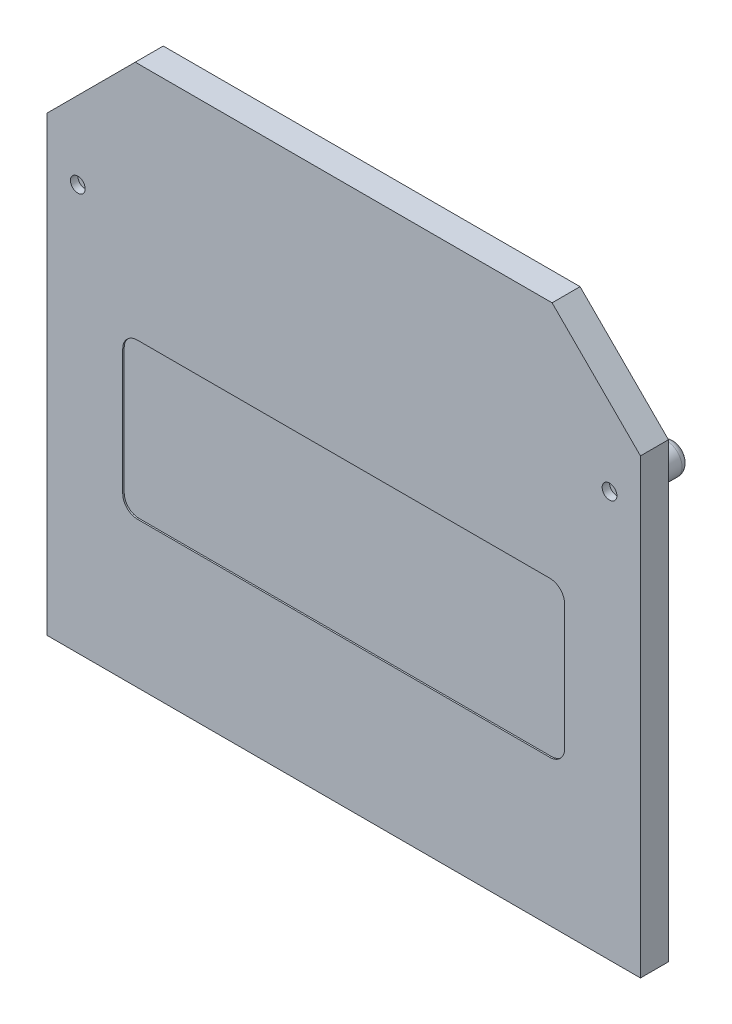
ISO-10303-21;
HEADER;
FILE_DESCRIPTION(('STEP AP214'),'2;1');
FILE_NAME('part.step','',(''),(''),'','','');
FILE_SCHEMA(('AUTOMOTIVE_DESIGN { 1 0 10303 214 1 1 1 1 }'));
ENDSEC;
DATA;
#1=APPLICATION_CONTEXT('core data for automotive mechanical design processes');
#2=APPLICATION_PROTOCOL_DEFINITION('international standard','automotive_design',2000,#1);
#3=PRODUCT_CONTEXT('',#1,'mechanical');
#4=PRODUCT('Part','Part','',(#3));
#5=PRODUCT_RELATED_PRODUCT_CATEGORY('part','',(#4));
#6=PRODUCT_DEFINITION_FORMATION('','',#4);
#7=PRODUCT_DEFINITION_CONTEXT('part definition',#1,'design');
#8=PRODUCT_DEFINITION('design','',#6,#7);
#9=PRODUCT_DEFINITION_SHAPE('','',#8);
#10=(LENGTH_UNIT() NAMED_UNIT(*) SI_UNIT(.MILLI.,.METRE.));
#11=(NAMED_UNIT(*) PLANE_ANGLE_UNIT() SI_UNIT($,.RADIAN.));
#12=(NAMED_UNIT(*) SI_UNIT($,.STERADIAN.) SOLID_ANGLE_UNIT());
#13=UNCERTAINTY_MEASURE_WITH_UNIT(LENGTH_MEASURE(1.E-05),#10,'distance_accuracy_value','');
#14=(GEOMETRIC_REPRESENTATION_CONTEXT(3) GLOBAL_UNCERTAINTY_ASSIGNED_CONTEXT((#13)) GLOBAL_UNIT_ASSIGNED_CONTEXT((#10,
#11,#12)) REPRESENTATION_CONTEXT('',''));
#15=CARTESIAN_POINT('',(0.,0.,0.));
#16=DIRECTION('',(0.,0.,1.));
#17=DIRECTION('',(1.,0.,0.));
#18=AXIS2_PLACEMENT_3D('',#15,#16,#17);
#19=CARTESIAN_POINT('',(-20.15,12.35,1.9));
#20=DIRECTION('',(1.,0.,0.));
#21=DIRECTION('',(0.,1.,0.));
#22=AXIS2_PLACEMENT_3D('',#19,#20,#21);
#23=PLANE('',#22);
#24=DIRECTION('',(0.,-1.,0.));
#25=VECTOR('',#24,1.);
#26=CARTESIAN_POINT('',(-20.15,12.35,0.));
#27=LINE('',#26,#25);
#28=CARTESIAN_POINT('',(-20.15,12.35,0.));
#29=VERTEX_POINT('',#28);
#30=CARTESIAN_POINT('',(-20.15,-18.35,0.));
#31=VERTEX_POINT('',#30);
#32=EDGE_CURVE('E115',#29,#31,#27,.T.);
#33=ORIENTED_EDGE('',*,*,#32,.T.);
#34=DIRECTION('',(0.,0.,-1.));
#35=VECTOR('',#34,1.);
#36=CARTESIAN_POINT('',(-20.15,-18.35,1.9));
#37=LINE('',#36,#35);
#38=CARTESIAN_POINT('',(-20.15,-18.35,1.9));
#39=VERTEX_POINT('',#38);
#40=EDGE_CURVE('E134',#39,#31,#37,.T.);
#41=ORIENTED_EDGE('',*,*,#40,.F.);
#42=DIRECTION('',(0.,-1.,0.));
#43=VECTOR('',#42,1.);
#44=CARTESIAN_POINT('',(-20.15,12.35,1.9));
#45=LINE('',#44,#43);
#46=CARTESIAN_POINT('',(-20.15,12.35,1.9));
#47=VERTEX_POINT('',#46);
#48=EDGE_CURVE('E127',#47,#39,#45,.T.);
#49=ORIENTED_EDGE('',*,*,#48,.F.);
#50=DIRECTION('',(0.,0.,-1.));
#51=VECTOR('',#50,1.);
#52=CARTESIAN_POINT('',(-20.15,12.35,1.9));
#53=LINE('',#52,#51);
#54=EDGE_CURVE('E111',#47,#29,#53,.T.);
#55=ORIENTED_EDGE('',*,*,#54,.T.);
#56=EDGE_LOOP('',(#33,#41,#49,#55));
#57=FACE_BOUND('',#56,.T.);
#58=ADVANCED_FACE('F17',(#57),#23,.F.);
#59=CARTESIAN_POINT('',(20.15,-18.35,1.9));
#60=DIRECTION('',(0.,1.,0.));
#61=DIRECTION('',(-1.,0.,0.));
#62=AXIS2_PLACEMENT_3D('',#59,#60,#61);
#63=PLANE('',#62);
#64=DIRECTION('',(1.,0.,0.));
#65=VECTOR('',#64,1.);
#66=CARTESIAN_POINT('',(20.15,-18.35,0.));
#67=LINE('',#66,#65);
#68=CARTESIAN_POINT('',(20.15,-18.35,0.));
#69=VERTEX_POINT('',#68);
#70=EDGE_CURVE('E118',#31,#69,#67,.T.);
#71=ORIENTED_EDGE('',*,*,#70,.T.);
#72=DIRECTION('',(0.,0.,-1.));
#73=VECTOR('',#72,1.);
#74=CARTESIAN_POINT('',(20.15,-18.35,1.9));
#75=LINE('',#74,#73);
#76=CARTESIAN_POINT('',(20.15,-18.35,1.9));
#77=VERTEX_POINT('',#76);
#78=EDGE_CURVE('E131',#77,#69,#75,.T.);
#79=ORIENTED_EDGE('',*,*,#78,.F.);
#80=DIRECTION('',(1.,0.,0.));
#81=VECTOR('',#80,1.);
#82=CARTESIAN_POINT('',(20.15,-18.35,1.9));
#83=LINE('',#82,#81);
#84=EDGE_CURVE('E77',#39,#77,#83,.T.);
#85=ORIENTED_EDGE('',*,*,#84,.F.);
#86=ORIENTED_EDGE('',*,*,#40,.T.);
#87=EDGE_LOOP('',(#71,#79,#85,#86));
#88=FACE_BOUND('',#87,.T.);
#89=ADVANCED_FACE('F164',(#88),#63,.F.);
#90=CARTESIAN_POINT('',(20.15,12.35,1.9));
#91=DIRECTION('',(-1.,0.,0.));
#92=DIRECTION('',(0.,-1.,0.));
#93=AXIS2_PLACEMENT_3D('',#90,#91,#92);
#94=PLANE('',#93);
#95=DIRECTION('',(0.,1.,0.));
#96=VECTOR('',#95,1.);
#97=CARTESIAN_POINT('',(20.15,12.35,0.));
#98=LINE('',#97,#96);
#99=CARTESIAN_POINT('',(20.15,12.35,0.));
#100=VERTEX_POINT('',#99);
#101=EDGE_CURVE('E121',#69,#100,#98,.T.);
#102=ORIENTED_EDGE('',*,*,#101,.T.);
#103=DIRECTION('',(0.,0.,-1.));
#104=VECTOR('',#103,1.);
#105=CARTESIAN_POINT('',(20.15,12.35,1.9));
#106=LINE('',#105,#104);
#107=CARTESIAN_POINT('',(20.15,12.35,1.9));
#108=VERTEX_POINT('',#107);
#109=EDGE_CURVE('E106',#108,#100,#106,.T.);
#110=ORIENTED_EDGE('',*,*,#109,.F.);
#111=DIRECTION('',(0.,1.,0.));
#112=VECTOR('',#111,1.);
#113=CARTESIAN_POINT('',(20.15,12.35,1.9));
#114=LINE('',#113,#112);
#115=EDGE_CURVE('E94',#77,#108,#114,.T.);
#116=ORIENTED_EDGE('',*,*,#115,.F.);
#117=ORIENTED_EDGE('',*,*,#78,.T.);
#118=EDGE_LOOP('',(#102,#110,#116,#117));
#119=FACE_BOUND('',#118,.T.);
#120=ADVANCED_FACE('F170',(#119),#94,.F.);
#121=CARTESIAN_POINT('',(20.15,12.35,1.9));
#122=DIRECTION('',(-0.707106781186548,-0.707106781186548,0.));
#123=DIRECTION('',(0.707106781186548,-0.707106781186548,0.));
#124=AXIS2_PLACEMENT_3D('',#121,#122,#123);
#125=PLANE('',#124);
#126=DIRECTION('',(-0.707106781186548,0.707106781186548,0.));
#127=VECTOR('',#126,1.);
#128=CARTESIAN_POINT('',(20.15,12.35,0.));
#129=LINE('',#128,#127);
#130=CARTESIAN_POINT('',(14.15,18.35,0.));
#131=VERTEX_POINT('',#130);
#132=EDGE_CURVE('E103',#100,#131,#129,.T.);
#133=ORIENTED_EDGE('',*,*,#132,.T.);
#134=DIRECTION('',(0.,0.,-1.));
#135=VECTOR('',#134,1.);
#136=CARTESIAN_POINT('',(14.15,18.35,1.9));
#137=LINE('',#136,#135);
#138=CARTESIAN_POINT('',(14.15,18.35,1.9));
#139=VERTEX_POINT('',#138);
#140=EDGE_CURVE('E100',#139,#131,#137,.T.);
#141=ORIENTED_EDGE('',*,*,#140,.F.);
#142=DIRECTION('',(-0.707106781186548,0.707106781186548,0.));
#143=VECTOR('',#142,1.);
#144=CARTESIAN_POINT('',(20.15,12.35,1.9));
#145=LINE('',#144,#143);
#146=EDGE_CURVE('E87',#108,#139,#145,.T.);
#147=ORIENTED_EDGE('',*,*,#146,.F.);
#148=ORIENTED_EDGE('',*,*,#109,.T.);
#149=EDGE_LOOP('',(#133,#141,#147,#148));
#150=FACE_BOUND('',#149,.T.);
#151=ADVANCED_FACE('F101',(#150),#125,.F.);
#152=CARTESIAN_POINT('',(14.15,18.35,1.9));
#153=DIRECTION('',(0.,-1.,0.));
#154=DIRECTION('',(1.,0.,0.));
#155=AXIS2_PLACEMENT_3D('',#152,#153,#154);
#156=PLANE('',#155);
#157=DIRECTION('',(-1.,0.,0.));
#158=VECTOR('',#157,1.);
#159=CARTESIAN_POINT('',(14.15,18.35,0.));
#160=LINE('',#159,#158);
#161=CARTESIAN_POINT('',(-14.15,18.35,0.));
#162=VERTEX_POINT('',#161);
#163=EDGE_CURVE('E124',#131,#162,#160,.T.);
#164=ORIENTED_EDGE('',*,*,#163,.T.);
#165=DIRECTION('',(0.,0.,-1.));
#166=VECTOR('',#165,1.);
#167=CARTESIAN_POINT('',(-14.15,18.35,1.9));
#168=LINE('',#167,#166);
#169=CARTESIAN_POINT('',(-14.15,18.35,1.9));
#170=VERTEX_POINT('',#169);
#171=EDGE_CURVE('E107',#170,#162,#168,.T.);
#172=ORIENTED_EDGE('',*,*,#171,.F.);
#173=DIRECTION('',(-1.,0.,0.));
#174=VECTOR('',#173,1.);
#175=CARTESIAN_POINT('',(14.15,18.35,1.9));
#176=LINE('',#175,#174);
#177=EDGE_CURVE('E91',#139,#170,#176,.T.);
#178=ORIENTED_EDGE('',*,*,#177,.F.);
#179=ORIENTED_EDGE('',*,*,#140,.T.);
#180=EDGE_LOOP('',(#164,#172,#178,#179));
#181=FACE_BOUND('',#180,.T.);
#182=ADVANCED_FACE('F109',(#181),#156,.F.);
#183=CARTESIAN_POINT('',(-14.15,18.35,1.9));
#184=DIRECTION('',(0.707106781186548,-0.707106781186548,0.));
#185=DIRECTION('',(0.707106781186548,0.707106781186548,0.));
#186=AXIS2_PLACEMENT_3D('',#183,#184,#185);
#187=PLANE('',#186);
#188=DIRECTION('',(-0.707106781186548,-0.707106781186548,0.));
#189=VECTOR('',#188,1.);
#190=CARTESIAN_POINT('',(-14.15,18.35,0.));
#191=LINE('',#190,#189);
#192=EDGE_CURVE('E68',#162,#29,#191,.T.);
#193=ORIENTED_EDGE('',*,*,#192,.T.);
#194=ORIENTED_EDGE('',*,*,#54,.F.);
#195=DIRECTION('',(-0.707106781186548,-0.707106781186548,0.));
#196=VECTOR('',#195,1.);
#197=CARTESIAN_POINT('',(-14.15,18.35,1.9));
#198=LINE('',#197,#196);
#199=EDGE_CURVE('E41',#170,#47,#198,.T.);
#200=ORIENTED_EDGE('',*,*,#199,.F.);
#201=ORIENTED_EDGE('',*,*,#171,.T.);
#202=EDGE_LOOP('',(#193,#194,#200,#201));
#203=FACE_BOUND('',#202,.T.);
#204=ADVANCED_FACE('F180',(#203),#187,.F.);
#205=CARTESIAN_POINT('',(0.,0.,1.9));
#206=DIRECTION('',(0.,0.,-1.));
#207=DIRECTION('',(-1.,0.,0.));
#208=AXIS2_PLACEMENT_3D('',#205,#206,#207);
#209=PLANE('',#208);
#210=CARTESIAN_POINT('',(18.05,9.2,1.9));
#211=DIRECTION('',(0.,0.,1.));
#212=DIRECTION('',(1.,0.,0.));
#213=AXIS2_PLACEMENT_3D('',#210,#211,#212);
#214=CIRCLE('',#213,0.5);
#215=CARTESIAN_POINT('',(18.55,9.2,1.9));
#216=VERTEX_POINT('',#215);
#217=EDGE_CURVE('E563',#216,#216,#214,.T.);
#218=ORIENTED_EDGE('',*,*,#217,.F.);
#219=EDGE_LOOP('',(#218));
#220=FACE_BOUND('',#219,.T.);
#221=CARTESIAN_POINT('',(-18.05,9.2,1.9));
#222=DIRECTION('',(0.,0.,1.));
#223=DIRECTION('',(1.,0.,0.));
#224=AXIS2_PLACEMENT_3D('',#221,#222,#223);
#225=CIRCLE('',#224,0.5);
#226=CARTESIAN_POINT('',(-17.55,9.2,1.9));
#227=VERTEX_POINT('',#226);
#228=EDGE_CURVE('E557',#227,#227,#225,.T.);
#229=ORIENTED_EDGE('',*,*,#228,.F.);
#230=EDGE_LOOP('',(#229));
#231=FACE_BOUND('',#230,.T.);
#232=DIRECTION('',(1.,0.,0.));
#233=VECTOR('',#232,1.);
#234=CARTESIAN_POINT('',(-14.,-8.45,1.9));
#235=LINE('',#234,#233);
#236=CARTESIAN_POINT('',(-14.,-8.45,1.9));
#237=VERTEX_POINT('',#236);
#238=CARTESIAN_POINT('',(14.,-8.45,1.9));
#239=VERTEX_POINT('',#238);
#240=EDGE_CURVE('E530',#237,#239,#235,.T.);
#241=ORIENTED_EDGE('',*,*,#240,.F.);
#242=CARTESIAN_POINT('',(-14.,-7.45,1.9));
#243=DIRECTION('',(0.,0.,1.));
#244=DIRECTION('',(1.,0.,0.));
#245=AXIS2_PLACEMENT_3D('',#242,#243,#244);
#246=CIRCLE('',#245,1.);
#247=CARTESIAN_POINT('',(-15.,-7.45,1.9));
#248=VERTEX_POINT('',#247);
#249=EDGE_CURVE('E32',#248,#237,#246,.T.);
#250=ORIENTED_EDGE('',*,*,#249,.F.);
#251=DIRECTION('',(0.,-1.,0.));
#252=VECTOR('',#251,1.);
#253=CARTESIAN_POINT('',(-15.,1.07999999999999,1.9));
#254=LINE('',#253,#252);
#255=CARTESIAN_POINT('',(-15.,1.07999999999999,1.9));
#256=VERTEX_POINT('',#255);
#257=EDGE_CURVE('E511',#256,#248,#254,.T.);
#258=ORIENTED_EDGE('',*,*,#257,.F.);
#259=CARTESIAN_POINT('',(-14.,1.08,1.9));
#260=DIRECTION('',(0.,0.,1.));
#261=DIRECTION('',(1.,0.,0.));
#262=AXIS2_PLACEMENT_3D('',#259,#260,#261);
#263=CIRCLE('',#262,1.);
#264=CARTESIAN_POINT('',(-14.,2.08,1.9));
#265=VERTEX_POINT('',#264);
#266=EDGE_CURVE('E515',#265,#256,#263,.T.);
#267=ORIENTED_EDGE('',*,*,#266,.F.);
#268=DIRECTION('',(-1.,0.,0.));
#269=VECTOR('',#268,1.);
#270=CARTESIAN_POINT('',(-14.,2.08,1.9));
#271=LINE('',#270,#269);
#272=CARTESIAN_POINT('',(14.,2.08,1.9));
#273=VERTEX_POINT('',#272);
#274=EDGE_CURVE('E518',#273,#265,#271,.T.);
#275=ORIENTED_EDGE('',*,*,#274,.F.);
#276=CARTESIAN_POINT('',(14.,1.08,1.9));
#277=DIRECTION('',(0.,0.,1.));
#278=DIRECTION('',(-1.,0.,0.));
#279=AXIS2_PLACEMENT_3D('',#276,#277,#278);
#280=CIRCLE('',#279,1.);
#281=CARTESIAN_POINT('',(15.,1.07999999999999,1.9));
#282=VERTEX_POINT('',#281);
#283=EDGE_CURVE('E521',#282,#273,#280,.T.);
#284=ORIENTED_EDGE('',*,*,#283,.F.);
#285=DIRECTION('',(0.,1.,0.));
#286=VECTOR('',#285,1.);
#287=CARTESIAN_POINT('',(15.,1.07999999999999,1.9));
#288=LINE('',#287,#286);
#289=CARTESIAN_POINT('',(15.,-7.45,1.9));
#290=VERTEX_POINT('',#289);
#291=EDGE_CURVE('E524',#290,#282,#288,.T.);
#292=ORIENTED_EDGE('',*,*,#291,.F.);
#293=CARTESIAN_POINT('',(14.,-7.45,1.9));
#294=DIRECTION('',(0.,0.,1.));
#295=DIRECTION('',(1.,0.,0.));
#296=AXIS2_PLACEMENT_3D('',#293,#294,#295);
#297=CIRCLE('',#296,1.);
#298=EDGE_CURVE('E527',#239,#290,#297,.T.);
#299=ORIENTED_EDGE('',*,*,#298,.F.);
#300=EDGE_LOOP('',(#241,#250,#258,#267,#275,#284,#292,#299));
#301=FACE_BOUND('',#300,.T.);
#302=ORIENTED_EDGE('',*,*,#48,.T.);
#303=ORIENTED_EDGE('',*,*,#84,.T.);
#304=ORIENTED_EDGE('',*,*,#115,.T.);
#305=ORIENTED_EDGE('',*,*,#146,.T.);
#306=ORIENTED_EDGE('',*,*,#177,.T.);
#307=ORIENTED_EDGE('',*,*,#199,.T.);
#308=EDGE_LOOP('',(#302,#303,#304,#305,#306,#307));
#309=FACE_BOUND('',#308,.T.);
#310=ADVANCED_FACE('F89',(#220,#231,#301,#309),#209,.F.);
#311=CARTESIAN_POINT('',(0.,0.,0.));
#312=DIRECTION('',(0.,0.,-1.));
#313=DIRECTION('',(-1.,0.,0.));
#314=AXIS2_PLACEMENT_3D('',#311,#312,#313);
#315=PLANE('',#314);
#316=CARTESIAN_POINT('',(18.05,9.2,0.));
#317=DIRECTION('',(0.,0.,-1.));
#318=DIRECTION('',(-1.,0.,0.));
#319=AXIS2_PLACEMENT_3D('',#316,#317,#318);
#320=CIRCLE('',#319,1.025);
#321=CARTESIAN_POINT('',(17.025,9.2,0.));
#322=VERTEX_POINT('',#321);
#323=EDGE_CURVE('E139',#322,#322,#320,.T.);
#324=ORIENTED_EDGE('',*,*,#323,.F.);
#325=EDGE_LOOP('',(#324));
#326=FACE_BOUND('',#325,.T.);
#327=CARTESIAN_POINT('',(-18.05,9.2,0.));
#328=DIRECTION('',(0.,0.,-1.));
#329=DIRECTION('',(-1.,0.,0.));
#330=AXIS2_PLACEMENT_3D('',#327,#328,#329);
#331=CIRCLE('',#330,1.025);
#332=CARTESIAN_POINT('',(-19.075,9.2,0.));
#333=VERTEX_POINT('',#332);
#334=EDGE_CURVE('E136',#333,#333,#331,.T.);
#335=ORIENTED_EDGE('',*,*,#334,.F.);
#336=EDGE_LOOP('',(#335));
#337=FACE_BOUND('',#336,.T.);
#338=ORIENTED_EDGE('',*,*,#32,.F.);
#339=ORIENTED_EDGE('',*,*,#192,.F.);
#340=ORIENTED_EDGE('',*,*,#163,.F.);
#341=ORIENTED_EDGE('',*,*,#132,.F.);
#342=ORIENTED_EDGE('',*,*,#101,.F.);
#343=ORIENTED_EDGE('',*,*,#70,.F.);
#344=EDGE_LOOP('',(#338,#339,#340,#341,#342,#343));
#345=FACE_BOUND('',#344,.T.);
#346=ADVANCED_FACE('F183',(#326,#337,#345),#315,.T.);
#347=CARTESIAN_POINT('',(-14.,-7.45,1.8));
#348=DIRECTION('',(0.,0.,1.));
#349=DIRECTION('',(1.,0.,0.));
#350=AXIS2_PLACEMENT_3D('',#347,#348,#349);
#351=CYLINDRICAL_SURFACE('',#350,1.);
#352=ORIENTED_EDGE('',*,*,#249,.T.);
#353=DIRECTION('',(0.,0.,1.));
#354=VECTOR('',#353,1.);
#355=CARTESIAN_POINT('',(-14.,-8.45,1.8));
#356=LINE('',#355,#354);
#357=CARTESIAN_POINT('',(-14.,-8.45,1.8));
#358=VERTEX_POINT('',#357);
#359=EDGE_CURVE('E489',#358,#237,#356,.T.);
#360=ORIENTED_EDGE('',*,*,#359,.F.);
#361=CARTESIAN_POINT('',(-14.,-7.45,1.8));
#362=DIRECTION('',(0.,0.,1.));
#363=DIRECTION('',(1.,0.,0.));
#364=AXIS2_PLACEMENT_3D('',#361,#362,#363);
#365=CIRCLE('',#364,1.);
#366=CARTESIAN_POINT('',(-15.,-7.45,1.8));
#367=VERTEX_POINT('',#366);
#368=EDGE_CURVE('E514',#367,#358,#365,.T.);
#369=ORIENTED_EDGE('',*,*,#368,.F.);
#370=DIRECTION('',(0.,0.,1.));
#371=VECTOR('',#370,1.);
#372=CARTESIAN_POINT('',(-15.,-7.45,1.8));
#373=LINE('',#372,#371);
#374=EDGE_CURVE('E119',#367,#248,#373,.T.);
#375=ORIENTED_EDGE('',*,*,#374,.T.);
#376=EDGE_LOOP('',(#352,#360,#369,#375));
#377=FACE_BOUND('',#376,.T.);
#378=ADVANCED_FACE('F186',(#377),#351,.F.);
#379=CARTESIAN_POINT('',(-15.,1.07999999999999,1.8));
#380=DIRECTION('',(-1.,0.,0.));
#381=DIRECTION('',(0.,-1.,0.));
#382=AXIS2_PLACEMENT_3D('',#379,#380,#381);
#383=PLANE('',#382);
#384=ORIENTED_EDGE('',*,*,#257,.T.);
#385=ORIENTED_EDGE('',*,*,#374,.F.);
#386=DIRECTION('',(0.,-1.,0.));
#387=VECTOR('',#386,1.);
#388=CARTESIAN_POINT('',(-15.,1.07999999999999,1.8));
#389=LINE('',#388,#387);
#390=CARTESIAN_POINT('',(-15.,1.07999999999999,1.8));
#391=VERTEX_POINT('',#390);
#392=EDGE_CURVE('E492',#391,#367,#389,.T.);
#393=ORIENTED_EDGE('',*,*,#392,.F.);
#394=DIRECTION('',(0.,0.,1.));
#395=VECTOR('',#394,1.);
#396=CARTESIAN_POINT('',(-15.,1.07999999999999,1.8));
#397=LINE('',#396,#395);
#398=EDGE_CURVE('E507',#391,#256,#397,.T.);
#399=ORIENTED_EDGE('',*,*,#398,.T.);
#400=EDGE_LOOP('',(#384,#385,#393,#399));
#401=FACE_BOUND('',#400,.T.);
#402=ADVANCED_FACE('F193',(#401),#383,.F.);
#403=CARTESIAN_POINT('',(-14.,1.08,1.8));
#404=DIRECTION('',(0.,0.,1.));
#405=DIRECTION('',(1.,0.,0.));
#406=AXIS2_PLACEMENT_3D('',#403,#404,#405);
#407=CYLINDRICAL_SURFACE('',#406,1.);
#408=ORIENTED_EDGE('',*,*,#266,.T.);
#409=ORIENTED_EDGE('',*,*,#398,.F.);
#410=CARTESIAN_POINT('',(-14.,1.08,1.8));
#411=DIRECTION('',(0.,0.,1.));
#412=DIRECTION('',(1.,0.,0.));
#413=AXIS2_PLACEMENT_3D('',#410,#411,#412);
#414=CIRCLE('',#413,1.);
#415=CARTESIAN_POINT('',(-14.,2.08,1.8));
#416=VERTEX_POINT('',#415);
#417=EDGE_CURVE('E537',#416,#391,#414,.T.);
#418=ORIENTED_EDGE('',*,*,#417,.F.);
#419=DIRECTION('',(0.,0.,1.));
#420=VECTOR('',#419,1.);
#421=CARTESIAN_POINT('',(-14.,2.08,1.8));
#422=LINE('',#421,#420);
#423=EDGE_CURVE('E504',#416,#265,#422,.T.);
#424=ORIENTED_EDGE('',*,*,#423,.T.);
#425=EDGE_LOOP('',(#408,#409,#418,#424));
#426=FACE_BOUND('',#425,.T.);
#427=ADVANCED_FACE('F214',(#426),#407,.F.);
#428=CARTESIAN_POINT('',(-14.,2.08,1.8));
#429=DIRECTION('',(0.,1.,0.));
#430=DIRECTION('',(0.,0.,1.));
#431=AXIS2_PLACEMENT_3D('',#428,#429,#430);
#432=PLANE('',#431);
#433=ORIENTED_EDGE('',*,*,#274,.T.);
#434=ORIENTED_EDGE('',*,*,#423,.F.);
#435=DIRECTION('',(-1.,0.,0.));
#436=VECTOR('',#435,1.);
#437=CARTESIAN_POINT('',(-14.,2.08,1.8));
#438=LINE('',#437,#436);
#439=CARTESIAN_POINT('',(14.,2.08,1.8));
#440=VERTEX_POINT('',#439);
#441=EDGE_CURVE('E540',#440,#416,#438,.T.);
#442=ORIENTED_EDGE('',*,*,#441,.F.);
#443=DIRECTION('',(0.,0.,1.));
#444=VECTOR('',#443,1.);
#445=CARTESIAN_POINT('',(14.,2.08,1.8));
#446=LINE('',#445,#444);
#447=EDGE_CURVE('E501',#440,#273,#446,.T.);
#448=ORIENTED_EDGE('',*,*,#447,.T.);
#449=EDGE_LOOP('',(#433,#434,#442,#448));
#450=FACE_BOUND('',#449,.T.);
#451=ADVANCED_FACE('F210',(#450),#432,.F.);
#452=CARTESIAN_POINT('',(14.,1.08,1.8));
#453=DIRECTION('',(0.,0.,1.));
#454=DIRECTION('',(1.,0.,0.));
#455=AXIS2_PLACEMENT_3D('',#452,#453,#454);
#456=CYLINDRICAL_SURFACE('',#455,1.);
#457=ORIENTED_EDGE('',*,*,#283,.T.);
#458=ORIENTED_EDGE('',*,*,#447,.F.);
#459=CARTESIAN_POINT('',(14.,1.08,1.8));
#460=DIRECTION('',(0.,0.,1.));
#461=DIRECTION('',(-1.,0.,0.));
#462=AXIS2_PLACEMENT_3D('',#459,#460,#461);
#463=CIRCLE('',#462,1.);
#464=CARTESIAN_POINT('',(15.,1.07999999999999,1.8));
#465=VERTEX_POINT('',#464);
#466=EDGE_CURVE('E543',#465,#440,#463,.T.);
#467=ORIENTED_EDGE('',*,*,#466,.F.);
#468=DIRECTION('',(0.,0.,1.));
#469=VECTOR('',#468,1.);
#470=CARTESIAN_POINT('',(15.,1.07999999999999,1.8));
#471=LINE('',#470,#469);
#472=EDGE_CURVE('E498',#465,#282,#471,.T.);
#473=ORIENTED_EDGE('',*,*,#472,.T.);
#474=EDGE_LOOP('',(#457,#458,#467,#473));
#475=FACE_BOUND('',#474,.T.);
#476=ADVANCED_FACE('F206',(#475),#456,.F.);
#477=CARTESIAN_POINT('',(15.,1.07999999999999,1.8));
#478=DIRECTION('',(1.,0.,0.));
#479=DIRECTION('',(0.,1.,0.));
#480=AXIS2_PLACEMENT_3D('',#477,#478,#479);
#481=PLANE('',#480);
#482=ORIENTED_EDGE('',*,*,#291,.T.);
#483=ORIENTED_EDGE('',*,*,#472,.F.);
#484=DIRECTION('',(0.,1.,0.));
#485=VECTOR('',#484,1.);
#486=CARTESIAN_POINT('',(15.,1.07999999999999,1.8));
#487=LINE('',#486,#485);
#488=CARTESIAN_POINT('',(15.,-7.45,1.8));
#489=VERTEX_POINT('',#488);
#490=EDGE_CURVE('E546',#489,#465,#487,.T.);
#491=ORIENTED_EDGE('',*,*,#490,.F.);
#492=DIRECTION('',(0.,0.,1.));
#493=VECTOR('',#492,1.);
#494=CARTESIAN_POINT('',(15.,-7.45,1.8));
#495=LINE('',#494,#493);
#496=EDGE_CURVE('E495',#489,#290,#495,.T.);
#497=ORIENTED_EDGE('',*,*,#496,.T.);
#498=EDGE_LOOP('',(#482,#483,#491,#497));
#499=FACE_BOUND('',#498,.T.);
#500=ADVANCED_FACE('F202',(#499),#481,.F.);
#501=CARTESIAN_POINT('',(14.,-7.45,1.8));
#502=DIRECTION('',(0.,0.,1.));
#503=DIRECTION('',(1.,0.,0.));
#504=AXIS2_PLACEMENT_3D('',#501,#502,#503);
#505=CYLINDRICAL_SURFACE('',#504,1.);
#506=ORIENTED_EDGE('',*,*,#298,.T.);
#507=ORIENTED_EDGE('',*,*,#496,.F.);
#508=CARTESIAN_POINT('',(14.,-7.45,1.8));
#509=DIRECTION('',(0.,0.,1.));
#510=DIRECTION('',(1.,0.,0.));
#511=AXIS2_PLACEMENT_3D('',#508,#509,#510);
#512=CIRCLE('',#511,1.);
#513=CARTESIAN_POINT('',(14.,-8.45,1.8));
#514=VERTEX_POINT('',#513);
#515=EDGE_CURVE('E549',#514,#489,#512,.T.);
#516=ORIENTED_EDGE('',*,*,#515,.F.);
#517=DIRECTION('',(0.,0.,1.));
#518=VECTOR('',#517,1.);
#519=CARTESIAN_POINT('',(14.,-8.45,1.8));
#520=LINE('',#519,#518);
#521=EDGE_CURVE('E491',#514,#239,#520,.T.);
#522=ORIENTED_EDGE('',*,*,#521,.T.);
#523=EDGE_LOOP('',(#506,#507,#516,#522));
#524=FACE_BOUND('',#523,.T.);
#525=ADVANCED_FACE('F198',(#524),#505,.F.);
#526=CARTESIAN_POINT('',(-14.,-8.45,1.8));
#527=DIRECTION('',(0.,-1.,0.));
#528=DIRECTION('',(0.,0.,-1.));
#529=AXIS2_PLACEMENT_3D('',#526,#527,#528);
#530=PLANE('',#529);
#531=ORIENTED_EDGE('',*,*,#240,.T.);
#532=ORIENTED_EDGE('',*,*,#521,.F.);
#533=DIRECTION('',(1.,0.,0.));
#534=VECTOR('',#533,1.);
#535=CARTESIAN_POINT('',(-14.,-8.45,1.8));
#536=LINE('',#535,#534);
#537=EDGE_CURVE('E552',#358,#514,#536,.T.);
#538=ORIENTED_EDGE('',*,*,#537,.F.);
#539=ORIENTED_EDGE('',*,*,#359,.T.);
#540=EDGE_LOOP('',(#531,#532,#538,#539));
#541=FACE_BOUND('',#540,.T.);
#542=ADVANCED_FACE('F194',(#541),#530,.F.);
#543=CARTESIAN_POINT('',(-14.,-7.45,1.8));
#544=DIRECTION('',(0.,0.,1.));
#545=DIRECTION('',(1.,0.,0.));
#546=AXIS2_PLACEMENT_3D('',#543,#544,#545);
#547=PLANE('',#546);
#548=ORIENTED_EDGE('',*,*,#368,.T.);
#549=ORIENTED_EDGE('',*,*,#537,.T.);
#550=ORIENTED_EDGE('',*,*,#515,.T.);
#551=ORIENTED_EDGE('',*,*,#490,.T.);
#552=ORIENTED_EDGE('',*,*,#466,.T.);
#553=ORIENTED_EDGE('',*,*,#441,.T.);
#554=ORIENTED_EDGE('',*,*,#417,.T.);
#555=ORIENTED_EDGE('',*,*,#392,.T.);
#556=EDGE_LOOP('',(#548,#549,#550,#551,#552,#553,#554,#555));
#557=FACE_BOUND('',#556,.T.);
#558=ADVANCED_FACE('F197',(#557),#547,.T.);
#559=CARTESIAN_POINT('',(-18.05,9.2,1.4));
#560=DIRECTION('',(0.,0.,1.));
#561=DIRECTION('',(1.,0.,0.));
#562=AXIS2_PLACEMENT_3D('',#559,#560,#561);
#563=CYLINDRICAL_SURFACE('',#562,0.5);
#564=CARTESIAN_POINT('',(-18.05,9.2,1.4));
#565=DIRECTION('',(0.,0.,1.));
#566=DIRECTION('',(1.,0.,0.));
#567=AXIS2_PLACEMENT_3D('',#564,#565,#566);
#568=CIRCLE('',#567,0.5);
#569=CARTESIAN_POINT('',(-17.55,9.2,1.4));
#570=VERTEX_POINT('',#569);
#571=EDGE_CURVE('E534',#570,#570,#568,.T.);
#572=ORIENTED_EDGE('',*,*,#571,.F.);
#573=EDGE_LOOP('',(#572));
#574=FACE_BOUND('',#573,.T.);
#575=ORIENTED_EDGE('',*,*,#228,.T.);
#576=EDGE_LOOP('',(#575));
#577=FACE_BOUND('',#576,.T.);
#578=ADVANCED_FACE('F224',(#574,#577),#563,.F.);
#579=CARTESIAN_POINT('',(-18.05,9.2,1.4));
#580=DIRECTION('',(0.,0.,1.));
#581=DIRECTION('',(1.,0.,0.));
#582=AXIS2_PLACEMENT_3D('',#579,#580,#581);
#583=PLANE('',#582);
#584=ORIENTED_EDGE('',*,*,#571,.T.);
#585=EDGE_LOOP('',(#584));
#586=FACE_BOUND('',#585,.T.);
#587=ADVANCED_FACE('F228',(#586),#583,.T.);
#588=CARTESIAN_POINT('',(18.05,9.2,1.4));
#589=DIRECTION('',(0.,0.,1.));
#590=DIRECTION('',(1.,0.,0.));
#591=AXIS2_PLACEMENT_3D('',#588,#589,#590);
#592=CYLINDRICAL_SURFACE('',#591,0.5);
#593=CARTESIAN_POINT('',(18.05,9.2,1.4));
#594=DIRECTION('',(0.,0.,1.));
#595=DIRECTION('',(1.,0.,0.));
#596=AXIS2_PLACEMENT_3D('',#593,#594,#595);
#597=CIRCLE('',#596,0.5);
#598=CARTESIAN_POINT('',(18.55,9.2,1.4));
#599=VERTEX_POINT('',#598);
#600=EDGE_CURVE('E560',#599,#599,#597,.T.);
#601=ORIENTED_EDGE('',*,*,#600,.F.);
#602=EDGE_LOOP('',(#601));
#603=FACE_BOUND('',#602,.T.);
#604=ORIENTED_EDGE('',*,*,#217,.T.);
#605=EDGE_LOOP('',(#604));
#606=FACE_BOUND('',#605,.T.);
#607=ADVANCED_FACE('F232',(#603,#606),#592,.F.);
#608=CARTESIAN_POINT('',(18.05,9.2,1.4));
#609=DIRECTION('',(0.,0.,1.));
#610=DIRECTION('',(1.,0.,0.));
#611=AXIS2_PLACEMENT_3D('',#608,#609,#610);
#612=PLANE('',#611);
#613=ORIENTED_EDGE('',*,*,#600,.T.);
#614=EDGE_LOOP('',(#613));
#615=FACE_BOUND('',#614,.T.);
#616=ADVANCED_FACE('F236',(#615),#612,.T.);
#617=CARTESIAN_POINT('',(-18.05,9.2,-2.5));
#618=DIRECTION('',(0.,0.,1.));
#619=DIRECTION('',(1.,0.,0.));
#620=AXIS2_PLACEMENT_3D('',#617,#618,#619);
#621=CYLINDRICAL_SURFACE('',#620,1.025);
#622=CARTESIAN_POINT('',(-18.05,9.2,-2.));
#623=DIRECTION('',(0.,0.,1.));
#624=DIRECTION('',(1.,0.,0.));
#625=AXIS2_PLACEMENT_3D('',#622,#623,#624);
#626=CIRCLE('',#625,1.025);
#627=CARTESIAN_POINT('',(-17.025,9.2,-2.));
#628=VERTEX_POINT('',#627);
#629=EDGE_CURVE('E142',#628,#628,#626,.T.);
#630=ORIENTED_EDGE('',*,*,#629,.T.);
#631=EDGE_LOOP('',(#630));
#632=FACE_BOUND('',#631,.T.);
#633=ORIENTED_EDGE('',*,*,#334,.T.);
#634=EDGE_LOOP('',(#633));
#635=FACE_BOUND('',#634,.T.);
#636=ADVANCED_FACE('F240',(#632,#635),#621,.T.);
#637=CARTESIAN_POINT('',(-18.05,9.2,-2.5));
#638=DIRECTION('',(0.,0.,1.));
#639=DIRECTION('',(1.,0.,0.));
#640=AXIS2_PLACEMENT_3D('',#637,#638,#639);
#641=PLANE('',#640);
#642=CARTESIAN_POINT('',(-18.05,9.2,-2.5));
#643=DIRECTION('',(0.,0.,1.));
#644=DIRECTION('',(1.,0.,0.));
#645=AXIS2_PLACEMENT_3D('',#642,#643,#644);
#646=CIRCLE('',#645,0.525);
#647=CARTESIAN_POINT('',(-17.525,9.2,-2.5));
#648=VERTEX_POINT('',#647);
#649=EDGE_CURVE('E145',#648,#648,#646,.F.);
#650=ORIENTED_EDGE('',*,*,#649,.T.);
#651=EDGE_LOOP('',(#650));
#652=FACE_BOUND('',#651,.T.);
#653=ADVANCED_FACE('F244',(#652),#641,.F.);
#654=CARTESIAN_POINT('',(18.05,9.2,-2.5));
#655=DIRECTION('',(0.,0.,1.));
#656=DIRECTION('',(1.,0.,0.));
#657=AXIS2_PLACEMENT_3D('',#654,#655,#656);
#658=CYLINDRICAL_SURFACE('',#657,1.025);
#659=CARTESIAN_POINT('',(18.05,9.2,-2.));
#660=DIRECTION('',(0.,0.,1.));
#661=DIRECTION('',(1.,0.,0.));
#662=AXIS2_PLACEMENT_3D('',#659,#660,#661);
#663=CIRCLE('',#662,1.025);
#664=CARTESIAN_POINT('',(19.075,9.2,-2.));
#665=VERTEX_POINT('',#664);
#666=EDGE_CURVE('E25',#665,#665,#663,.T.);
#667=ORIENTED_EDGE('',*,*,#666,.T.);
#668=EDGE_LOOP('',(#667));
#669=FACE_BOUND('',#668,.T.);
#670=ORIENTED_EDGE('',*,*,#323,.T.);
#671=EDGE_LOOP('',(#670));
#672=FACE_BOUND('',#671,.T.);
#673=ADVANCED_FACE('F150',(#669,#672),#658,.T.);
#674=CARTESIAN_POINT('',(18.05,9.2,-2.5));
#675=DIRECTION('',(0.,0.,1.));
#676=DIRECTION('',(1.,0.,0.));
#677=AXIS2_PLACEMENT_3D('',#674,#675,#676);
#678=PLANE('',#677);
#679=CARTESIAN_POINT('',(18.05,9.2,-2.5));
#680=DIRECTION('',(0.,0.,1.));
#681=DIRECTION('',(1.,0.,0.));
#682=AXIS2_PLACEMENT_3D('',#679,#680,#681);
#683=CIRCLE('',#682,0.525);
#684=CARTESIAN_POINT('',(18.575,9.2,-2.5));
#685=VERTEX_POINT('',#684);
#686=EDGE_CURVE('E11',#685,#685,#683,.F.);
#687=ORIENTED_EDGE('',*,*,#686,.T.);
#688=EDGE_LOOP('',(#687));
#689=FACE_BOUND('',#688,.T.);
#690=ADVANCED_FACE('F160',(#689),#678,.F.);
#691=CARTESIAN_POINT('',(-18.05,9.2,-2.));
#692=DIRECTION('',(0.,0.,1.));
#693=DIRECTION('',(1.,0.,0.));
#694=AXIS2_PLACEMENT_3D('',#691,#692,#693);
#695=TOROIDAL_SURFACE('',#694,0.525,0.5);
#696=ORIENTED_EDGE('',*,*,#649,.F.);
#697=EDGE_LOOP('',(#696));
#698=FACE_BOUND('',#697,.T.);
#699=ORIENTED_EDGE('',*,*,#629,.F.);
#700=EDGE_LOOP('',(#699));
#701=FACE_BOUND('',#700,.T.);
#702=ADVANCED_FACE('F154',(#698,#701),#695,.T.);
#703=CARTESIAN_POINT('',(18.05,9.2,-2.));
#704=DIRECTION('',(0.,0.,1.));
#705=DIRECTION('',(1.,0.,0.));
#706=AXIS2_PLACEMENT_3D('',#703,#704,#705);
#707=TOROIDAL_SURFACE('',#706,0.525,0.5);
#708=ORIENTED_EDGE('',*,*,#686,.F.);
#709=EDGE_LOOP('',(#708));
#710=FACE_BOUND('',#709,.T.);
#711=ORIENTED_EDGE('',*,*,#666,.F.);
#712=EDGE_LOOP('',(#711));
#713=FACE_BOUND('',#712,.T.);
#714=ADVANCED_FACE('F19',(#710,#713),#707,.T.);
#715=CLOSED_SHELL('',(#58,#89,#120,#151,#182,#204,#310,#346,#378,#402,#427,#451,#476,#500,#525,
#542,#558,#578,#587,#607,#616,#636,#653,#673,#690,#702,#714));
#716=MANIFOLD_SOLID_BREP('B1',#715);
#717=ADVANCED_BREP_SHAPE_REPRESENTATION('',(#18,#716),#14);
#718=SHAPE_DEFINITION_REPRESENTATION(#9,#717);
ENDSEC;
END-ISO-10303-21;
